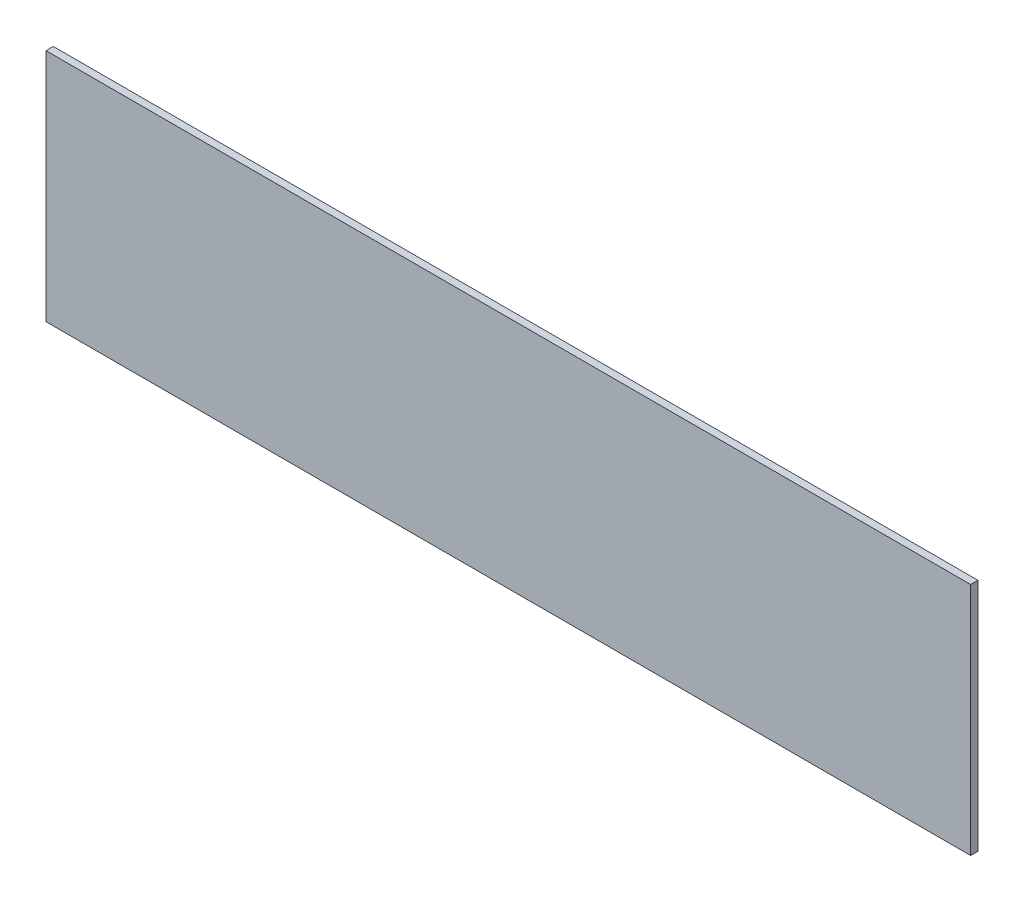
ISO-10303-21;
HEADER;
FILE_DESCRIPTION(('STEP AP214'),'2;1');
FILE_NAME('part.step','',(''),(''),'','','');
FILE_SCHEMA(('AUTOMOTIVE_DESIGN { 1 0 10303 214 1 1 1 1 }'));
ENDSEC;
DATA;
#1=APPLICATION_CONTEXT('core data for automotive mechanical design processes');
#2=APPLICATION_PROTOCOL_DEFINITION('international standard','automotive_design',2000,#1);
#3=PRODUCT_CONTEXT('',#1,'mechanical');
#4=PRODUCT('Part','Part','',(#3));
#5=PRODUCT_RELATED_PRODUCT_CATEGORY('part','',(#4));
#6=PRODUCT_DEFINITION_FORMATION('','',#4);
#7=PRODUCT_DEFINITION_CONTEXT('part definition',#1,'design');
#8=PRODUCT_DEFINITION('design','',#6,#7);
#9=PRODUCT_DEFINITION_SHAPE('','',#8);
#10=(LENGTH_UNIT() NAMED_UNIT(*) SI_UNIT(.MILLI.,.METRE.));
#11=(NAMED_UNIT(*) PLANE_ANGLE_UNIT() SI_UNIT($,.RADIAN.));
#12=(NAMED_UNIT(*) SI_UNIT($,.STERADIAN.) SOLID_ANGLE_UNIT());
#13=UNCERTAINTY_MEASURE_WITH_UNIT(LENGTH_MEASURE(1.E-05),#10,'distance_accuracy_value','');
#14=(GEOMETRIC_REPRESENTATION_CONTEXT(3) GLOBAL_UNCERTAINTY_ASSIGNED_CONTEXT((#13)) GLOBAL_UNIT_ASSIGNED_CONTEXT((#10,
#11,#12)) REPRESENTATION_CONTEXT('',''));
#15=CARTESIAN_POINT('',(0.,0.,0.));
#16=DIRECTION('',(0.,0.,1.));
#17=DIRECTION('',(1.,0.,0.));
#18=AXIS2_PLACEMENT_3D('',#15,#16,#17);
#19=CARTESIAN_POINT('',(149.85,38.0375,2.38125));
#20=DIRECTION('',(-1.,0.,0.));
#21=DIRECTION('',(0.,0.,1.));
#22=AXIS2_PLACEMENT_3D('',#19,#20,#21);
#23=PLANE('',#22);
#24=DIRECTION('',(0.,1.,0.));
#25=VECTOR('',#24,1.);
#26=CARTESIAN_POINT('',(149.85,38.0375,0.));
#27=LINE('',#26,#25);
#28=CARTESIAN_POINT('',(149.85,-38.0375,0.));
#29=VERTEX_POINT('',#28);
#30=CARTESIAN_POINT('',(149.85,38.0375,0.));
#31=VERTEX_POINT('',#30);
#32=EDGE_CURVE('E106',#29,#31,#27,.T.);
#33=ORIENTED_EDGE('',*,*,#32,.T.);
#34=DIRECTION('',(0.,0.,-1.));
#35=VECTOR('',#34,1.);
#36=CARTESIAN_POINT('',(149.85,38.0375,2.38125));
#37=LINE('',#36,#35);
#38=CARTESIAN_POINT('',(149.85,38.0375,2.38125));
#39=VERTEX_POINT('',#38);
#40=EDGE_CURVE('E11',#39,#31,#37,.T.);
#41=ORIENTED_EDGE('',*,*,#40,.F.);
#42=DIRECTION('',(0.,1.,0.));
#43=VECTOR('',#42,1.);
#44=CARTESIAN_POINT('',(149.85,38.0375,2.38125));
#45=LINE('',#44,#43);
#46=CARTESIAN_POINT('',(149.85,-38.0375,2.38125));
#47=VERTEX_POINT('',#46);
#48=EDGE_CURVE('E94',#47,#39,#45,.T.);
#49=ORIENTED_EDGE('',*,*,#48,.F.);
#50=DIRECTION('',(0.,0.,-1.));
#51=VECTOR('',#50,1.);
#52=CARTESIAN_POINT('',(149.85,-38.0375,2.38125));
#53=LINE('',#52,#51);
#54=EDGE_CURVE('E102',#47,#29,#53,.T.);
#55=ORIENTED_EDGE('',*,*,#54,.T.);
#56=EDGE_LOOP('',(#33,#41,#49,#55));
#57=FACE_BOUND('',#56,.T.);
#58=ADVANCED_FACE('F43',(#57),#23,.F.);
#59=CARTESIAN_POINT('',(-149.85,38.0375,2.38125));
#60=DIRECTION('',(0.,-1.,0.));
#61=DIRECTION('',(0.,0.,-1.));
#62=AXIS2_PLACEMENT_3D('',#59,#60,#61);
#63=PLANE('',#62);
#64=DIRECTION('',(-1.,0.,0.));
#65=VECTOR('',#64,1.);
#66=CARTESIAN_POINT('',(-149.85,38.0375,0.));
#67=LINE('',#66,#65);
#68=CARTESIAN_POINT('',(-149.85,38.0375,0.));
#69=VERTEX_POINT('',#68);
#70=EDGE_CURVE('E98',#31,#69,#67,.T.);
#71=ORIENTED_EDGE('',*,*,#70,.T.);
#72=DIRECTION('',(0.,0.,-1.));
#73=VECTOR('',#72,1.);
#74=CARTESIAN_POINT('',(-149.85,38.0375,2.38125));
#75=LINE('',#74,#73);
#76=CARTESIAN_POINT('',(-149.85,38.0375,2.38125));
#77=VERTEX_POINT('',#76);
#78=EDGE_CURVE('E51',#77,#69,#75,.T.);
#79=ORIENTED_EDGE('',*,*,#78,.F.);
#80=DIRECTION('',(-1.,0.,0.));
#81=VECTOR('',#80,1.);
#82=CARTESIAN_POINT('',(-149.85,38.0375,2.38125));
#83=LINE('',#82,#81);
#84=EDGE_CURVE('E89',#39,#77,#83,.T.);
#85=ORIENTED_EDGE('',*,*,#84,.F.);
#86=ORIENTED_EDGE('',*,*,#40,.T.);
#87=EDGE_LOOP('',(#71,#79,#85,#86));
#88=FACE_BOUND('',#87,.T.);
#89=ADVANCED_FACE('F97',(#88),#63,.F.);
#90=CARTESIAN_POINT('',(-149.85,38.0375,2.38125));
#91=DIRECTION('',(1.,0.,0.));
#92=DIRECTION('',(0.,0.,-1.));
#93=AXIS2_PLACEMENT_3D('',#90,#91,#92);
#94=PLANE('',#93);
#95=DIRECTION('',(0.,-1.,0.));
#96=VECTOR('',#95,1.);
#97=CARTESIAN_POINT('',(-149.85,38.0375,0.));
#98=LINE('',#97,#96);
#99=CARTESIAN_POINT('',(-149.85,-38.0375,0.));
#100=VERTEX_POINT('',#99);
#101=EDGE_CURVE('E76',#69,#100,#98,.T.);
#102=ORIENTED_EDGE('',*,*,#101,.T.);
#103=DIRECTION('',(0.,0.,-1.));
#104=VECTOR('',#103,1.);
#105=CARTESIAN_POINT('',(-149.85,-38.0375,2.38125));
#106=LINE('',#105,#104);
#107=CARTESIAN_POINT('',(-149.85,-38.0375,2.38125));
#108=VERTEX_POINT('',#107);
#109=EDGE_CURVE('E99',#108,#100,#106,.T.);
#110=ORIENTED_EDGE('',*,*,#109,.F.);
#111=DIRECTION('',(0.,-1.,0.));
#112=VECTOR('',#111,1.);
#113=CARTESIAN_POINT('',(-149.85,38.0375,2.38125));
#114=LINE('',#113,#112);
#115=EDGE_CURVE('E92',#77,#108,#114,.T.);
#116=ORIENTED_EDGE('',*,*,#115,.F.);
#117=ORIENTED_EDGE('',*,*,#78,.T.);
#118=EDGE_LOOP('',(#102,#110,#116,#117));
#119=FACE_BOUND('',#118,.T.);
#120=ADVANCED_FACE('F100',(#119),#94,.F.);
#121=CARTESIAN_POINT('',(-149.85,-38.0375,2.38125));
#122=DIRECTION('',(0.,1.,0.));
#123=DIRECTION('',(0.,0.,1.));
#124=AXIS2_PLACEMENT_3D('',#121,#122,#123);
#125=PLANE('',#124);
#126=DIRECTION('',(1.,0.,0.));
#127=VECTOR('',#126,1.);
#128=CARTESIAN_POINT('',(-149.85,-38.0375,0.));
#129=LINE('',#128,#127);
#130=EDGE_CURVE('E82',#100,#29,#129,.T.);
#131=ORIENTED_EDGE('',*,*,#130,.T.);
#132=ORIENTED_EDGE('',*,*,#54,.F.);
#133=DIRECTION('',(1.,0.,0.));
#134=VECTOR('',#133,1.);
#135=CARTESIAN_POINT('',(-149.85,-38.0375,2.38125));
#136=LINE('',#135,#134);
#137=EDGE_CURVE('E59',#108,#47,#136,.T.);
#138=ORIENTED_EDGE('',*,*,#137,.F.);
#139=ORIENTED_EDGE('',*,*,#109,.T.);
#140=EDGE_LOOP('',(#131,#132,#138,#139));
#141=FACE_BOUND('',#140,.T.);
#142=ADVANCED_FACE('F113',(#141),#125,.F.);
#143=CARTESIAN_POINT('',(0.,0.,2.38125));
#144=DIRECTION('',(0.,0.,1.));
#145=DIRECTION('',(1.,0.,0.));
#146=AXIS2_PLACEMENT_3D('',#143,#144,#145);
#147=PLANE('',#146);
#148=ORIENTED_EDGE('',*,*,#48,.T.);
#149=ORIENTED_EDGE('',*,*,#84,.T.);
#150=ORIENTED_EDGE('',*,*,#115,.T.);
#151=ORIENTED_EDGE('',*,*,#137,.T.);
#152=EDGE_LOOP('',(#148,#149,#150,#151));
#153=FACE_BOUND('',#152,.T.);
#154=ADVANCED_FACE('F90',(#153),#147,.T.);
#155=CARTESIAN_POINT('',(0.,0.,0.));
#156=DIRECTION('',(0.,0.,1.));
#157=DIRECTION('',(1.,0.,0.));
#158=AXIS2_PLACEMENT_3D('',#155,#156,#157);
#159=PLANE('',#158);
#160=ORIENTED_EDGE('',*,*,#32,.F.);
#161=ORIENTED_EDGE('',*,*,#130,.F.);
#162=ORIENTED_EDGE('',*,*,#101,.F.);
#163=ORIENTED_EDGE('',*,*,#70,.F.);
#164=EDGE_LOOP('',(#160,#161,#162,#163));
#165=FACE_BOUND('',#164,.T.);
#166=ADVANCED_FACE('F116',(#165),#159,.F.);
#167=CLOSED_SHELL('',(#58,#89,#120,#142,#154,#166));
#168=MANIFOLD_SOLID_BREP('B2',#167);
#169=ADVANCED_BREP_SHAPE_REPRESENTATION('',(#18,#168),#14);
#170=SHAPE_DEFINITION_REPRESENTATION(#9,#169);
ENDSEC;
END-ISO-10303-21;
